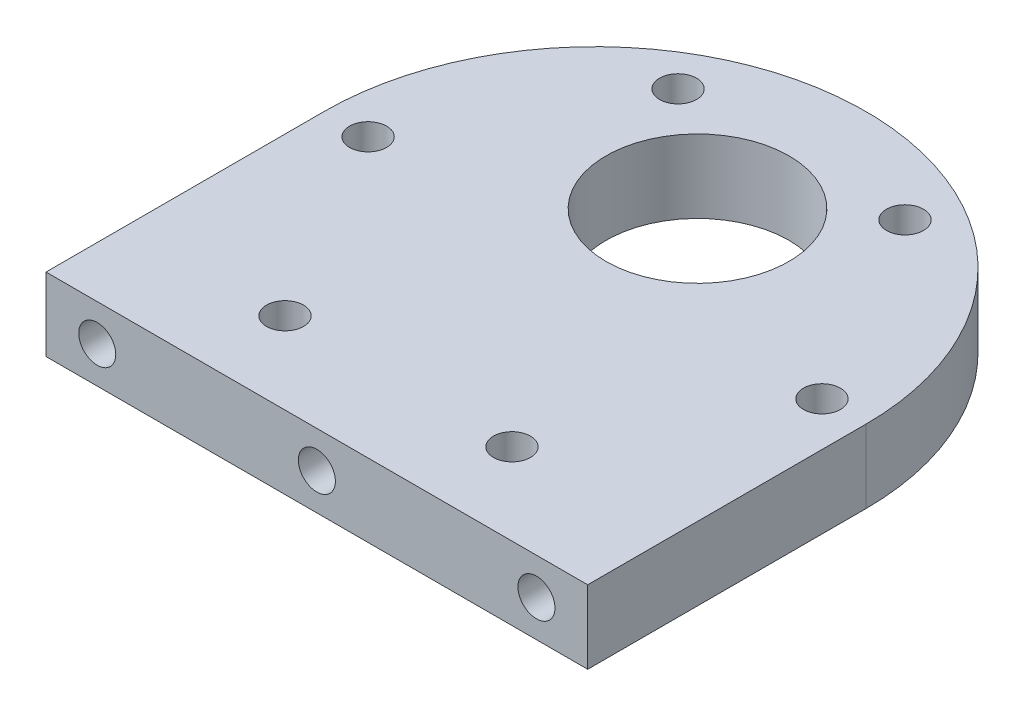
ISO-10303-21;
HEADER;
FILE_DESCRIPTION(('STEP AP214'),'2;1');
FILE_NAME('part.step','',(''),(''),'','','');
FILE_SCHEMA(('AUTOMOTIVE_DESIGN { 1 0 10303 214 1 1 1 1 }'));
ENDSEC;
DATA;
#1=APPLICATION_CONTEXT('core data for automotive mechanical design processes');
#2=APPLICATION_PROTOCOL_DEFINITION('international standard','automotive_design',2000,#1);
#3=PRODUCT_CONTEXT('',#1,'mechanical');
#4=PRODUCT('Part','Part','',(#3));
#5=PRODUCT_RELATED_PRODUCT_CATEGORY('part','',(#4));
#6=PRODUCT_DEFINITION_FORMATION('','',#4);
#7=PRODUCT_DEFINITION_CONTEXT('part definition',#1,'design');
#8=PRODUCT_DEFINITION('design','',#6,#7);
#9=PRODUCT_DEFINITION_SHAPE('','',#8);
#10=(LENGTH_UNIT() NAMED_UNIT(*) SI_UNIT(.MILLI.,.METRE.));
#11=(NAMED_UNIT(*) PLANE_ANGLE_UNIT() SI_UNIT($,.RADIAN.));
#12=(NAMED_UNIT(*) SI_UNIT($,.STERADIAN.) SOLID_ANGLE_UNIT());
#13=UNCERTAINTY_MEASURE_WITH_UNIT(LENGTH_MEASURE(1.E-05),#10,'distance_accuracy_value','');
#14=(GEOMETRIC_REPRESENTATION_CONTEXT(3) GLOBAL_UNCERTAINTY_ASSIGNED_CONTEXT((#13)) GLOBAL_UNIT_ASSIGNED_CONTEXT((#10,
#11,#12)) REPRESENTATION_CONTEXT('',''));
#15=CARTESIAN_POINT('',(0.,0.,0.));
#16=DIRECTION('',(0.,0.,1.));
#17=DIRECTION('',(1.,0.,0.));
#18=AXIS2_PLACEMENT_3D('',#15,#16,#17);
#19=CARTESIAN_POINT('',(18.5,5.,-19.));
#20=DIRECTION('',(0.,1.,0.));
#21=DIRECTION('',(0.,0.,1.));
#22=AXIS2_PLACEMENT_3D('',#19,#20,#21);
#23=PLANE('',#22);
#24=CARTESIAN_POINT('',(18.5,5.,-26.));
#25=DIRECTION('',(0.,1.,0.));
#26=DIRECTION('',(0.,0.,1.));
#27=AXIS2_PLACEMENT_3D('',#24,#25,#26);
#28=CIRCLE('',#27,6.25);
#29=CARTESIAN_POINT('',(18.5,5.,-19.75));
#30=VERTEX_POINT('',#29);
#31=EDGE_CURVE('E148',#30,#30,#28,.F.);
#32=ORIENTED_EDGE('',*,*,#31,.T.);
#33=EDGE_LOOP('',(#32));
#34=FACE_BOUND('',#33,.T.);
#35=CARTESIAN_POINT('',(10.7500000000001,5.,-5.57660624134115));
#36=DIRECTION('',(0.,1.,0.));
#37=DIRECTION('',(0.,0.,1.));
#38=AXIS2_PLACEMENT_3D('',#35,#36,#37);
#39=CIRCLE('',#38,1.26499999999933);
#40=CARTESIAN_POINT('',(10.7500000000001,5.,-4.31160624134183));
#41=VERTEX_POINT('',#40);
#42=EDGE_CURVE('E136',#41,#41,#39,.T.);
#43=ORIENTED_EDGE('',*,*,#42,.F.);
#44=EDGE_LOOP('',(#43));
#45=FACE_BOUND('',#44,.T.);
#46=CARTESIAN_POINT('',(34.,5.,-19.0000000000001));
#47=DIRECTION('',(0.,1.,0.));
#48=DIRECTION('',(0.,0.,1.));
#49=AXIS2_PLACEMENT_3D('',#46,#47,#48);
#50=CIRCLE('',#49,1.26499999999901);
#51=CARTESIAN_POINT('',(34.,5.,-17.7350000000011));
#52=VERTEX_POINT('',#51);
#53=EDGE_CURVE('E124',#52,#52,#50,.T.);
#54=ORIENTED_EDGE('',*,*,#53,.F.);
#55=EDGE_LOOP('',(#54));
#56=FACE_BOUND('',#55,.T.);
#57=CARTESIAN_POINT('',(10.7499999999999,5.,-32.4233937586588));
#58=DIRECTION('',(0.,1.,0.));
#59=DIRECTION('',(0.,0.,1.));
#60=AXIS2_PLACEMENT_3D('',#57,#58,#59);
#61=CIRCLE('',#60,1.26500000000001);
#62=CARTESIAN_POINT('',(10.7499999999999,5.,-31.1583937586588));
#63=VERTEX_POINT('',#62);
#64=EDGE_CURVE('E103',#63,#63,#61,.T.);
#65=ORIENTED_EDGE('',*,*,#64,.F.);
#66=EDGE_LOOP('',(#65));
#67=FACE_BOUND('',#66,.T.);
#68=DIRECTION('',(0.,0.,1.));
#69=VECTOR('',#68,1.);
#70=CARTESIAN_POINT('',(0.,5.,0.));
#71=LINE('',#70,#69);
#72=CARTESIAN_POINT('',(0.,5.,-19.));
#73=VERTEX_POINT('',#72);
#74=CARTESIAN_POINT('',(0.,5.,0.));
#75=VERTEX_POINT('',#74);
#76=EDGE_CURVE('E88',#73,#75,#71,.T.);
#77=ORIENTED_EDGE('',*,*,#76,.T.);
#78=DIRECTION('',(1.,0.,0.));
#79=VECTOR('',#78,1.);
#80=CARTESIAN_POINT('',(0.,5.,0.));
#81=LINE('',#80,#79);
#82=CARTESIAN_POINT('',(37.,5.,0.));
#83=VERTEX_POINT('',#82);
#84=EDGE_CURVE('E83',#75,#83,#81,.T.);
#85=ORIENTED_EDGE('',*,*,#84,.T.);
#86=DIRECTION('',(0.,0.,-1.));
#87=VECTOR('',#86,1.);
#88=CARTESIAN_POINT('',(37.,5.,0.));
#89=LINE('',#88,#87);
#90=CARTESIAN_POINT('',(37.,5.,-19.));
#91=VERTEX_POINT('',#90);
#92=EDGE_CURVE('E86',#83,#91,#89,.T.);
#93=ORIENTED_EDGE('',*,*,#92,.T.);
#94=CARTESIAN_POINT('',(18.5,5.,-19.));
#95=DIRECTION('',(0.,1.,0.));
#96=DIRECTION('',(0.,0.,1.));
#97=AXIS2_PLACEMENT_3D('',#94,#95,#96);
#98=CIRCLE('',#97,18.5);
#99=EDGE_CURVE('E53',#91,#73,#98,.T.);
#100=ORIENTED_EDGE('',*,*,#99,.T.);
#101=EDGE_LOOP('',(#77,#85,#93,#100));
#102=FACE_BOUND('',#101,.T.);
#103=CARTESIAN_POINT('',(26.2499999999999,5.,-32.4233937586588));
#104=DIRECTION('',(0.,1.,0.));
#105=DIRECTION('',(0.,0.,1.));
#106=AXIS2_PLACEMENT_3D('',#103,#104,#105);
#107=CIRCLE('',#106,1.26499999999961);
#108=CARTESIAN_POINT('',(26.2499999999999,5.,-31.1583937586592));
#109=VERTEX_POINT('',#108);
#110=EDGE_CURVE('E118',#109,#109,#107,.T.);
#111=ORIENTED_EDGE('',*,*,#110,.F.);
#112=EDGE_LOOP('',(#111));
#113=FACE_BOUND('',#112,.T.);
#114=CARTESIAN_POINT('',(26.2500000000001,5.,-5.57660624134124));
#115=DIRECTION('',(0.,1.,0.));
#116=DIRECTION('',(0.,0.,1.));
#117=AXIS2_PLACEMENT_3D('',#114,#115,#116);
#118=CIRCLE('',#117,1.26499999999884);
#119=CARTESIAN_POINT('',(26.2500000000001,5.,-4.31160624134239));
#120=VERTEX_POINT('',#119);
#121=EDGE_CURVE('E130',#120,#120,#118,.T.);
#122=ORIENTED_EDGE('',*,*,#121,.F.);
#123=EDGE_LOOP('',(#122));
#124=FACE_BOUND('',#123,.T.);
#125=CARTESIAN_POINT('',(2.99999999999999,5.,-18.9999999999999));
#126=DIRECTION('',(0.,1.,0.));
#127=DIRECTION('',(0.,0.,1.));
#128=AXIS2_PLACEMENT_3D('',#125,#126,#127);
#129=CIRCLE('',#128,1.265);
#130=CARTESIAN_POINT('',(2.99999999999999,5.,-17.7349999999999));
#131=VERTEX_POINT('',#130);
#132=EDGE_CURVE('E142',#131,#131,#129,.T.);
#133=ORIENTED_EDGE('',*,*,#132,.F.);
#134=EDGE_LOOP('',(#133));
#135=FACE_BOUND('',#134,.T.);
#136=ADVANCED_FACE('F36',(#34,#45,#56,#67,#102,#113,#124,#135),#23,.T.);
#137=CARTESIAN_POINT('',(18.5,0.,-19.));
#138=DIRECTION('',(0.,1.,0.));
#139=DIRECTION('',(0.,0.,1.));
#140=AXIS2_PLACEMENT_3D('',#137,#138,#139);
#141=PLANE('',#140);
#142=CARTESIAN_POINT('',(18.5,0.,-26.));
#143=DIRECTION('',(0.,-1.,0.));
#144=DIRECTION('',(0.,0.,-1.));
#145=AXIS2_PLACEMENT_3D('',#142,#143,#144);
#146=CIRCLE('',#145,6.25);
#147=CARTESIAN_POINT('',(18.5,0.,-32.25));
#148=VERTEX_POINT('',#147);
#149=EDGE_CURVE('E153',#148,#148,#146,.T.);
#150=ORIENTED_EDGE('',*,*,#149,.F.);
#151=EDGE_LOOP('',(#150));
#152=FACE_BOUND('',#151,.T.);
#153=DIRECTION('',(0.,0.,1.));
#154=VECTOR('',#153,1.);
#155=CARTESIAN_POINT('',(0.,0.,0.));
#156=LINE('',#155,#154);
#157=CARTESIAN_POINT('',(0.,0.,-19.));
#158=VERTEX_POINT('',#157);
#159=CARTESIAN_POINT('',(0.,0.,0.));
#160=VERTEX_POINT('',#159);
#161=EDGE_CURVE('E100',#158,#160,#156,.T.);
#162=ORIENTED_EDGE('',*,*,#161,.F.);
#163=CARTESIAN_POINT('',(18.5,0.,-19.));
#164=DIRECTION('',(0.,1.,0.));
#165=DIRECTION('',(0.,0.,1.));
#166=AXIS2_PLACEMENT_3D('',#163,#164,#165);
#167=CIRCLE('',#166,18.5);
#168=CARTESIAN_POINT('',(37.,0.,-19.));
#169=VERTEX_POINT('',#168);
#170=EDGE_CURVE('E76',#169,#158,#167,.T.);
#171=ORIENTED_EDGE('',*,*,#170,.F.);
#172=DIRECTION('',(0.,0.,-1.));
#173=VECTOR('',#172,1.);
#174=CARTESIAN_POINT('',(37.,0.,0.));
#175=LINE('',#174,#173);
#176=CARTESIAN_POINT('',(37.,0.,0.));
#177=VERTEX_POINT('',#176);
#178=EDGE_CURVE('E70',#177,#169,#175,.T.);
#179=ORIENTED_EDGE('',*,*,#178,.F.);
#180=DIRECTION('',(1.,0.,0.));
#181=VECTOR('',#180,1.);
#182=CARTESIAN_POINT('',(0.,0.,0.));
#183=LINE('',#182,#181);
#184=EDGE_CURVE('E92',#160,#177,#183,.T.);
#185=ORIENTED_EDGE('',*,*,#184,.F.);
#186=EDGE_LOOP('',(#162,#171,#179,#185));
#187=FACE_BOUND('',#186,.T.);
#188=CARTESIAN_POINT('',(10.7499999999999,0.,-32.4233937586588));
#189=DIRECTION('',(0.,1.,0.));
#190=DIRECTION('',(0.,0.,1.));
#191=AXIS2_PLACEMENT_3D('',#188,#189,#190);
#192=CIRCLE('',#191,1.26500000000001);
#193=CARTESIAN_POINT('',(10.7499999999999,0.,-31.1583937586588));
#194=VERTEX_POINT('',#193);
#195=EDGE_CURVE('E115',#194,#194,#192,.T.);
#196=ORIENTED_EDGE('',*,*,#195,.T.);
#197=EDGE_LOOP('',(#196));
#198=FACE_BOUND('',#197,.T.);
#199=CARTESIAN_POINT('',(26.2499999999999,0.,-32.4233937586588));
#200=DIRECTION('',(0.,1.,0.));
#201=DIRECTION('',(0.,0.,1.));
#202=AXIS2_PLACEMENT_3D('',#199,#200,#201);
#203=CIRCLE('',#202,1.26499999999961);
#204=CARTESIAN_POINT('',(26.2499999999999,0.,-31.1583937586592));
#205=VERTEX_POINT('',#204);
#206=EDGE_CURVE('E121',#205,#205,#203,.T.);
#207=ORIENTED_EDGE('',*,*,#206,.T.);
#208=EDGE_LOOP('',(#207));
#209=FACE_BOUND('',#208,.T.);
#210=CARTESIAN_POINT('',(34.,0.,-19.0000000000001));
#211=DIRECTION('',(0.,1.,0.));
#212=DIRECTION('',(0.,0.,1.));
#213=AXIS2_PLACEMENT_3D('',#210,#211,#212);
#214=CIRCLE('',#213,1.26499999999901);
#215=CARTESIAN_POINT('',(34.,0.,-17.7350000000011));
#216=VERTEX_POINT('',#215);
#217=EDGE_CURVE('E127',#216,#216,#214,.T.);
#218=ORIENTED_EDGE('',*,*,#217,.T.);
#219=EDGE_LOOP('',(#218));
#220=FACE_BOUND('',#219,.T.);
#221=CARTESIAN_POINT('',(26.2500000000001,0.,-5.57660624134124));
#222=DIRECTION('',(0.,1.,0.));
#223=DIRECTION('',(0.,0.,1.));
#224=AXIS2_PLACEMENT_3D('',#221,#222,#223);
#225=CIRCLE('',#224,1.26499999999884);
#226=CARTESIAN_POINT('',(26.2500000000001,0.,-4.31160624134239));
#227=VERTEX_POINT('',#226);
#228=EDGE_CURVE('E133',#227,#227,#225,.T.);
#229=ORIENTED_EDGE('',*,*,#228,.T.);
#230=EDGE_LOOP('',(#229));
#231=FACE_BOUND('',#230,.T.);
#232=CARTESIAN_POINT('',(10.7500000000001,0.,-5.57660624134115));
#233=DIRECTION('',(0.,1.,0.));
#234=DIRECTION('',(0.,0.,1.));
#235=AXIS2_PLACEMENT_3D('',#232,#233,#234);
#236=CIRCLE('',#235,1.26499999999933);
#237=CARTESIAN_POINT('',(10.7500000000001,0.,-4.31160624134183));
#238=VERTEX_POINT('',#237);
#239=EDGE_CURVE('E139',#238,#238,#236,.T.);
#240=ORIENTED_EDGE('',*,*,#239,.T.);
#241=EDGE_LOOP('',(#240));
#242=FACE_BOUND('',#241,.T.);
#243=CARTESIAN_POINT('',(2.99999999999999,0.,-18.9999999999999));
#244=DIRECTION('',(0.,1.,0.));
#245=DIRECTION('',(0.,0.,1.));
#246=AXIS2_PLACEMENT_3D('',#243,#244,#245);
#247=CIRCLE('',#246,1.265);
#248=CARTESIAN_POINT('',(2.99999999999999,0.,-17.7349999999999));
#249=VERTEX_POINT('',#248);
#250=EDGE_CURVE('E145',#249,#249,#247,.T.);
#251=ORIENTED_EDGE('',*,*,#250,.T.);
#252=EDGE_LOOP('',(#251));
#253=FACE_BOUND('',#252,.T.);
#254=ADVANCED_FACE('F111',(#152,#187,#198,#209,#220,#231,#242,#253),#141,.F.);
#255=CARTESIAN_POINT('',(0.,5.,0.));
#256=DIRECTION('',(1.,0.,0.));
#257=DIRECTION('',(0.,0.,-1.));
#258=AXIS2_PLACEMENT_3D('',#255,#256,#257);
#259=PLANE('',#258);
#260=ORIENTED_EDGE('',*,*,#161,.T.);
#261=DIRECTION('',(0.,-1.,0.));
#262=VECTOR('',#261,1.);
#263=CARTESIAN_POINT('',(0.,5.,0.));
#264=LINE('',#263,#262);
#265=EDGE_CURVE('E11',#75,#160,#264,.T.);
#266=ORIENTED_EDGE('',*,*,#265,.F.);
#267=ORIENTED_EDGE('',*,*,#76,.F.);
#268=DIRECTION('',(0.,-1.,0.));
#269=VECTOR('',#268,1.);
#270=CARTESIAN_POINT('',(0.,5.,-19.));
#271=LINE('',#270,#269);
#272=EDGE_CURVE('E96',#73,#158,#271,.T.);
#273=ORIENTED_EDGE('',*,*,#272,.T.);
#274=EDGE_LOOP('',(#260,#266,#267,#273));
#275=FACE_BOUND('',#274,.T.);
#276=ADVANCED_FACE('F38',(#275),#259,.F.);
#277=CARTESIAN_POINT('',(0.,5.,0.));
#278=DIRECTION('',(0.,0.,-1.));
#279=DIRECTION('',(-1.,0.,0.));
#280=AXIS2_PLACEMENT_3D('',#277,#278,#279);
#281=PLANE('',#280);
#282=CARTESIAN_POINT('',(3.5,2.5,0.));
#283=DIRECTION('',(0.,0.,1.));
#284=DIRECTION('',(1.,0.,0.));
#285=AXIS2_PLACEMENT_3D('',#282,#283,#284);
#286=CIRCLE('',#285,1.265);
#287=CARTESIAN_POINT('',(4.765,2.5,0.));
#288=VERTEX_POINT('',#287);
#289=EDGE_CURVE('E169',#288,#288,#286,.T.);
#290=ORIENTED_EDGE('',*,*,#289,.F.);
#291=EDGE_LOOP('',(#290));
#292=FACE_BOUND('',#291,.T.);
#293=CARTESIAN_POINT('',(18.5,2.5,0.));
#294=DIRECTION('',(0.,0.,1.));
#295=DIRECTION('',(1.,0.,0.));
#296=AXIS2_PLACEMENT_3D('',#293,#294,#295);
#297=CIRCLE('',#296,1.265);
#298=CARTESIAN_POINT('',(19.765,2.5,0.));
#299=VERTEX_POINT('',#298);
#300=EDGE_CURVE('E163',#299,#299,#297,.T.);
#301=ORIENTED_EDGE('',*,*,#300,.F.);
#302=EDGE_LOOP('',(#301));
#303=FACE_BOUND('',#302,.T.);
#304=CARTESIAN_POINT('',(33.5,2.5,0.));
#305=DIRECTION('',(0.,0.,1.));
#306=DIRECTION('',(1.,0.,0.));
#307=AXIS2_PLACEMENT_3D('',#304,#305,#306);
#308=CIRCLE('',#307,1.265);
#309=CARTESIAN_POINT('',(34.765,2.5,0.));
#310=VERTEX_POINT('',#309);
#311=EDGE_CURVE('E157',#310,#310,#308,.T.);
#312=ORIENTED_EDGE('',*,*,#311,.F.);
#313=EDGE_LOOP('',(#312));
#314=FACE_BOUND('',#313,.T.);
#315=ORIENTED_EDGE('',*,*,#184,.T.);
#316=DIRECTION('',(0.,-1.,0.));
#317=VECTOR('',#316,1.);
#318=CARTESIAN_POINT('',(37.,5.,0.));
#319=LINE('',#318,#317);
#320=EDGE_CURVE('E45',#83,#177,#319,.T.);
#321=ORIENTED_EDGE('',*,*,#320,.F.);
#322=ORIENTED_EDGE('',*,*,#84,.F.);
#323=ORIENTED_EDGE('',*,*,#265,.T.);
#324=EDGE_LOOP('',(#315,#321,#322,#323));
#325=FACE_BOUND('',#324,.T.);
#326=ADVANCED_FACE('F91',(#292,#303,#314,#325),#281,.F.);
#327=CARTESIAN_POINT('',(37.,5.,0.));
#328=DIRECTION('',(-1.,0.,0.));
#329=DIRECTION('',(0.,0.,1.));
#330=AXIS2_PLACEMENT_3D('',#327,#328,#329);
#331=PLANE('',#330);
#332=ORIENTED_EDGE('',*,*,#178,.T.);
#333=DIRECTION('',(0.,-1.,0.));
#334=VECTOR('',#333,1.);
#335=CARTESIAN_POINT('',(37.,5.,-19.));
#336=LINE('',#335,#334);
#337=EDGE_CURVE('E93',#91,#169,#336,.T.);
#338=ORIENTED_EDGE('',*,*,#337,.F.);
#339=ORIENTED_EDGE('',*,*,#92,.F.);
#340=ORIENTED_EDGE('',*,*,#320,.T.);
#341=EDGE_LOOP('',(#332,#338,#339,#340));
#342=FACE_BOUND('',#341,.T.);
#343=ADVANCED_FACE('F94',(#342),#331,.F.);
#344=CARTESIAN_POINT('',(18.5,5.,-19.));
#345=DIRECTION('',(0.,-1.,0.));
#346=DIRECTION('',(0.,0.,-1.));
#347=AXIS2_PLACEMENT_3D('',#344,#345,#346);
#348=CYLINDRICAL_SURFACE('',#347,18.5);
#349=ORIENTED_EDGE('',*,*,#170,.T.);
#350=ORIENTED_EDGE('',*,*,#272,.F.);
#351=ORIENTED_EDGE('',*,*,#99,.F.);
#352=ORIENTED_EDGE('',*,*,#337,.T.);
#353=EDGE_LOOP('',(#349,#350,#351,#352));
#354=FACE_BOUND('',#353,.T.);
#355=ADVANCED_FACE('F108',(#354),#348,.T.);
#356=CARTESIAN_POINT('',(10.7499999999999,5.,-32.4233937586588));
#357=DIRECTION('',(0.,-1.,0.));
#358=DIRECTION('',(0.,0.,-1.));
#359=AXIS2_PLACEMENT_3D('',#356,#357,#358);
#360=CYLINDRICAL_SURFACE('',#359,1.26500000000001);
#361=ORIENTED_EDGE('',*,*,#64,.T.);
#362=EDGE_LOOP('',(#361));
#363=FACE_BOUND('',#362,.T.);
#364=ORIENTED_EDGE('',*,*,#195,.F.);
#365=EDGE_LOOP('',(#364));
#366=FACE_BOUND('',#365,.T.);
#367=ADVANCED_FACE('F217',(#363,#366),#360,.F.);
#368=CARTESIAN_POINT('',(26.2499999999999,5.,-32.4233937586588));
#369=DIRECTION('',(0.,-1.,0.));
#370=DIRECTION('',(0.,0.,-1.));
#371=AXIS2_PLACEMENT_3D('',#368,#369,#370);
#372=CYLINDRICAL_SURFACE('',#371,1.26499999999961);
#373=ORIENTED_EDGE('',*,*,#110,.T.);
#374=EDGE_LOOP('',(#373));
#375=FACE_BOUND('',#374,.T.);
#376=ORIENTED_EDGE('',*,*,#206,.F.);
#377=EDGE_LOOP('',(#376));
#378=FACE_BOUND('',#377,.T.);
#379=ADVANCED_FACE('F239',(#375,#378),#372,.F.);
#380=CARTESIAN_POINT('',(34.,5.,-19.0000000000001));
#381=DIRECTION('',(0.,-1.,0.));
#382=DIRECTION('',(0.,0.,-1.));
#383=AXIS2_PLACEMENT_3D('',#380,#381,#382);
#384=CYLINDRICAL_SURFACE('',#383,1.26499999999901);
#385=ORIENTED_EDGE('',*,*,#53,.T.);
#386=EDGE_LOOP('',(#385));
#387=FACE_BOUND('',#386,.T.);
#388=ORIENTED_EDGE('',*,*,#217,.F.);
#389=EDGE_LOOP('',(#388));
#390=FACE_BOUND('',#389,.T.);
#391=ADVANCED_FACE('F246',(#387,#390),#384,.F.);
#392=CARTESIAN_POINT('',(26.2500000000001,5.,-5.57660624134124));
#393=DIRECTION('',(0.,-1.,0.));
#394=DIRECTION('',(0.,0.,-1.));
#395=AXIS2_PLACEMENT_3D('',#392,#393,#394);
#396=CYLINDRICAL_SURFACE('',#395,1.26499999999884);
#397=ORIENTED_EDGE('',*,*,#121,.T.);
#398=EDGE_LOOP('',(#397));
#399=FACE_BOUND('',#398,.T.);
#400=ORIENTED_EDGE('',*,*,#228,.F.);
#401=EDGE_LOOP('',(#400));
#402=FACE_BOUND('',#401,.T.);
#403=ADVANCED_FACE('F253',(#399,#402),#396,.F.);
#404=CARTESIAN_POINT('',(10.7500000000001,5.,-5.57660624134115));
#405=DIRECTION('',(0.,-1.,0.));
#406=DIRECTION('',(0.,0.,-1.));
#407=AXIS2_PLACEMENT_3D('',#404,#405,#406);
#408=CYLINDRICAL_SURFACE('',#407,1.26499999999933);
#409=ORIENTED_EDGE('',*,*,#42,.T.);
#410=EDGE_LOOP('',(#409));
#411=FACE_BOUND('',#410,.T.);
#412=ORIENTED_EDGE('',*,*,#239,.F.);
#413=EDGE_LOOP('',(#412));
#414=FACE_BOUND('',#413,.T.);
#415=ADVANCED_FACE('F261',(#411,#414),#408,.F.);
#416=CARTESIAN_POINT('',(2.99999999999999,5.,-18.9999999999999));
#417=DIRECTION('',(0.,-1.,0.));
#418=DIRECTION('',(0.,0.,-1.));
#419=AXIS2_PLACEMENT_3D('',#416,#417,#418);
#420=CYLINDRICAL_SURFACE('',#419,1.265);
#421=ORIENTED_EDGE('',*,*,#132,.T.);
#422=EDGE_LOOP('',(#421));
#423=FACE_BOUND('',#422,.T.);
#424=ORIENTED_EDGE('',*,*,#250,.F.);
#425=EDGE_LOOP('',(#424));
#426=FACE_BOUND('',#425,.T.);
#427=ADVANCED_FACE('F203',(#423,#426),#420,.F.);
#428=CARTESIAN_POINT('',(18.5,22.6776695296637,-26.));
#429=DIRECTION('',(0.,-1.,0.));
#430=DIRECTION('',(0.,0.,-1.));
#431=AXIS2_PLACEMENT_3D('',#428,#429,#430);
#432=CYLINDRICAL_SURFACE('',#431,6.25);
#433=ORIENTED_EDGE('',*,*,#149,.T.);
#434=EDGE_LOOP('',(#433));
#435=FACE_BOUND('',#434,.T.);
#436=ORIENTED_EDGE('',*,*,#31,.F.);
#437=EDGE_LOOP('',(#436));
#438=FACE_BOUND('',#437,.T.);
#439=ADVANCED_FACE('F193',(#435,#438),#432,.F.);
#440=CARTESIAN_POINT('',(33.5,2.5,-12.));
#441=DIRECTION('',(0.,0.,1.));
#442=DIRECTION('',(1.,0.,0.));
#443=AXIS2_PLACEMENT_3D('',#440,#441,#442);
#444=CYLINDRICAL_SURFACE('',#443,1.265);
#445=CARTESIAN_POINT('',(33.5,2.5,-12.));
#446=DIRECTION('',(0.,0.,1.));
#447=DIRECTION('',(1.,0.,0.));
#448=AXIS2_PLACEMENT_3D('',#445,#446,#447);
#449=CIRCLE('',#448,1.265);
#450=CARTESIAN_POINT('',(34.765,2.5,-12.));
#451=VERTEX_POINT('',#450);
#452=EDGE_CURVE('E160',#451,#451,#449,.T.);
#453=ORIENTED_EDGE('',*,*,#452,.F.);
#454=EDGE_LOOP('',(#453));
#455=FACE_BOUND('',#454,.T.);
#456=ORIENTED_EDGE('',*,*,#311,.T.);
#457=EDGE_LOOP('',(#456));
#458=FACE_BOUND('',#457,.T.);
#459=ADVANCED_FACE('F190',(#455,#458),#444,.F.);
#460=CARTESIAN_POINT('',(33.5,2.5,-12.));
#461=DIRECTION('',(0.,0.,1.));
#462=DIRECTION('',(1.,0.,0.));
#463=AXIS2_PLACEMENT_3D('',#460,#461,#462);
#464=PLANE('',#463);
#465=ORIENTED_EDGE('',*,*,#452,.T.);
#466=EDGE_LOOP('',(#465));
#467=FACE_BOUND('',#466,.T.);
#468=ADVANCED_FACE('F192',(#467),#464,.T.);
#469=CARTESIAN_POINT('',(18.5,2.5,-12.));
#470=DIRECTION('',(0.,0.,1.));
#471=DIRECTION('',(1.,0.,0.));
#472=AXIS2_PLACEMENT_3D('',#469,#470,#471);
#473=CYLINDRICAL_SURFACE('',#472,1.265);
#474=CARTESIAN_POINT('',(18.5,2.5,-12.));
#475=DIRECTION('',(0.,0.,1.));
#476=DIRECTION('',(1.,0.,0.));
#477=AXIS2_PLACEMENT_3D('',#474,#475,#476);
#478=CIRCLE('',#477,1.265);
#479=CARTESIAN_POINT('',(19.765,2.5,-12.));
#480=VERTEX_POINT('',#479);
#481=EDGE_CURVE('E166',#480,#480,#478,.T.);
#482=ORIENTED_EDGE('',*,*,#481,.F.);
#483=EDGE_LOOP('',(#482));
#484=FACE_BOUND('',#483,.T.);
#485=ORIENTED_EDGE('',*,*,#300,.T.);
#486=EDGE_LOOP('',(#485));
#487=FACE_BOUND('',#486,.T.);
#488=ADVANCED_FACE('F200',(#484,#487),#473,.F.);
#489=CARTESIAN_POINT('',(18.5,2.5,-12.));
#490=DIRECTION('',(0.,0.,1.));
#491=DIRECTION('',(1.,0.,0.));
#492=AXIS2_PLACEMENT_3D('',#489,#490,#491);
#493=PLANE('',#492);
#494=ORIENTED_EDGE('',*,*,#481,.T.);
#495=EDGE_LOOP('',(#494));
#496=FACE_BOUND('',#495,.T.);
#497=ADVANCED_FACE('F180',(#496),#493,.T.);
#498=CARTESIAN_POINT('',(3.5,2.5,-12.));
#499=DIRECTION('',(0.,0.,1.));
#500=DIRECTION('',(1.,0.,0.));
#501=AXIS2_PLACEMENT_3D('',#498,#499,#500);
#502=CYLINDRICAL_SURFACE('',#501,1.265);
#503=CARTESIAN_POINT('',(3.5,2.5,-12.));
#504=DIRECTION('',(0.,0.,1.));
#505=DIRECTION('',(1.,0.,0.));
#506=AXIS2_PLACEMENT_3D('',#503,#504,#505);
#507=CIRCLE('',#506,1.265);
#508=CARTESIAN_POINT('',(4.765,2.5,-12.));
#509=VERTEX_POINT('',#508);
#510=EDGE_CURVE('E156',#509,#509,#507,.T.);
#511=ORIENTED_EDGE('',*,*,#510,.F.);
#512=EDGE_LOOP('',(#511));
#513=FACE_BOUND('',#512,.T.);
#514=ORIENTED_EDGE('',*,*,#289,.T.);
#515=EDGE_LOOP('',(#514));
#516=FACE_BOUND('',#515,.T.);
#517=ADVANCED_FACE('F177',(#513,#516),#502,.F.);
#518=CARTESIAN_POINT('',(3.5,2.5,-12.));
#519=DIRECTION('',(0.,0.,1.));
#520=DIRECTION('',(1.,0.,0.));
#521=AXIS2_PLACEMENT_3D('',#518,#519,#520);
#522=PLANE('',#521);
#523=ORIENTED_EDGE('',*,*,#510,.T.);
#524=EDGE_LOOP('',(#523));
#525=FACE_BOUND('',#524,.T.);
#526=ADVANCED_FACE('F175',(#525),#522,.T.);
#527=CLOSED_SHELL('',(#136,#254,#276,#326,#343,#355,#367,#379,#391,#403,#415,#427,#439,#459,
#468,#488,#497,#517,#526));
#528=MANIFOLD_SOLID_BREP('B2',#527);
#529=ADVANCED_BREP_SHAPE_REPRESENTATION('',(#18,#528),#14);
#530=SHAPE_DEFINITION_REPRESENTATION(#9,#529);
ENDSEC;
END-ISO-10303-21;
